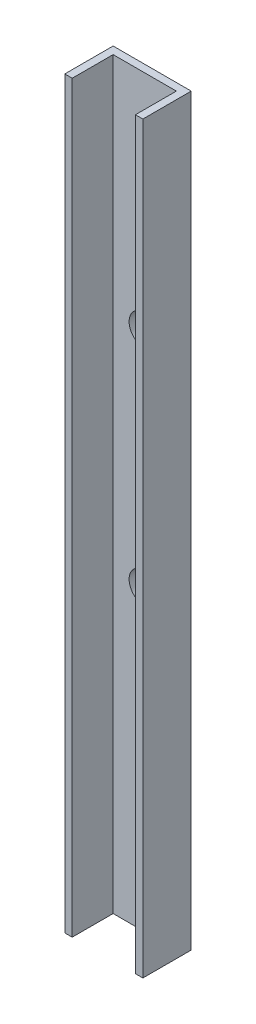
ISO-10303-21;
HEADER;
FILE_DESCRIPTION(('STEP AP214'),'2;1');
FILE_NAME('part.step','',(''),(''),'','','');
FILE_SCHEMA(('AUTOMOTIVE_DESIGN { 1 0 10303 214 1 1 1 1 }'));
ENDSEC;
DATA;
#1=APPLICATION_CONTEXT('core data for automotive mechanical design processes');
#2=APPLICATION_PROTOCOL_DEFINITION('international standard','automotive_design',2000,#1);
#3=PRODUCT_CONTEXT('',#1,'mechanical');
#4=PRODUCT('Part','Part','',(#3));
#5=PRODUCT_RELATED_PRODUCT_CATEGORY('part','',(#4));
#6=PRODUCT_DEFINITION_FORMATION('','',#4);
#7=PRODUCT_DEFINITION_CONTEXT('part definition',#1,'design');
#8=PRODUCT_DEFINITION('design','',#6,#7);
#9=PRODUCT_DEFINITION_SHAPE('','',#8);
#10=(LENGTH_UNIT() NAMED_UNIT(*) SI_UNIT(.MILLI.,.METRE.));
#11=(NAMED_UNIT(*) PLANE_ANGLE_UNIT() SI_UNIT($,.RADIAN.));
#12=(NAMED_UNIT(*) SI_UNIT($,.STERADIAN.) SOLID_ANGLE_UNIT());
#13=UNCERTAINTY_MEASURE_WITH_UNIT(LENGTH_MEASURE(1.E-05),#10,'distance_accuracy_value','');
#14=(GEOMETRIC_REPRESENTATION_CONTEXT(3) GLOBAL_UNCERTAINTY_ASSIGNED_CONTEXT((#13)) GLOBAL_UNIT_ASSIGNED_CONTEXT((#10,
#11,#12)) REPRESENTATION_CONTEXT('',''));
#15=CARTESIAN_POINT('',(0.,0.,0.));
#16=DIRECTION('',(0.,0.,1.));
#17=DIRECTION('',(1.,0.,0.));
#18=AXIS2_PLACEMENT_3D('',#15,#16,#17);
#19=CARTESIAN_POINT('',(6.03004291845494,100.,-4.68669527896996));
#20=DIRECTION('',(1.,0.,0.));
#21=DIRECTION('',(0.,0.,-1.));
#22=AXIS2_PLACEMENT_3D('',#19,#20,#21);
#23=PLANE('',#22);
#24=DIRECTION('',(0.,0.,1.));
#25=VECTOR('',#24,1.);
#26=CARTESIAN_POINT('',(6.03004291845494,0.,-4.68669527896996));
#27=LINE('',#26,#25);
#28=CARTESIAN_POINT('',(6.03004291845494,0.,-3.68669527896996));
#29=VERTEX_POINT('',#28);
#30=CARTESIAN_POINT('',(6.03004291845494,0.,1.81330472103004));
#31=VERTEX_POINT('',#30);
#32=EDGE_CURVE('E132',#29,#31,#27,.T.);
#33=ORIENTED_EDGE('',*,*,#32,.T.);
#34=DIRECTION('',(0.,-1.,0.));
#35=VECTOR('',#34,1.);
#36=CARTESIAN_POINT('',(6.03004291845494,100.,1.81330472103004));
#37=LINE('',#36,#35);
#38=CARTESIAN_POINT('',(6.03004291845494,100.,1.81330472103004));
#39=VERTEX_POINT('',#38);
#40=EDGE_CURVE('E11',#39,#31,#37,.T.);
#41=ORIENTED_EDGE('',*,*,#40,.F.);
#42=DIRECTION('',(0.,0.,1.));
#43=VECTOR('',#42,1.);
#44=CARTESIAN_POINT('',(6.03004291845494,100.,-4.68669527896996));
#45=LINE('',#44,#43);
#46=CARTESIAN_POINT('',(6.03004291845494,100.,-3.68669527896996));
#47=VERTEX_POINT('',#46);
#48=EDGE_CURVE('E90',#47,#39,#45,.T.);
#49=ORIENTED_EDGE('',*,*,#48,.F.);
#50=DIRECTION('',(0.,-1.,0.));
#51=VECTOR('',#50,1.);
#52=CARTESIAN_POINT('',(6.03004291845494,100.,-3.68669527896996));
#53=LINE('',#52,#51);
#54=EDGE_CURVE('E131',#47,#29,#53,.T.);
#55=ORIENTED_EDGE('',*,*,#54,.T.);
#56=EDGE_LOOP('',(#33,#41,#49,#55));
#57=FACE_BOUND('',#56,.T.);
#58=ADVANCED_FACE('F33',(#57),#23,.F.);
#59=CARTESIAN_POINT('',(7.03004291845494,100.,1.81330472103004));
#60=DIRECTION('',(0.,0.,1.));
#61=DIRECTION('',(1.,0.,0.));
#62=AXIS2_PLACEMENT_3D('',#59,#60,#61);
#63=PLANE('',#62);
#64=DIRECTION('',(-1.,0.,0.));
#65=VECTOR('',#64,1.);
#66=CARTESIAN_POINT('',(7.03004291845494,0.,1.81330472103004));
#67=LINE('',#66,#65);
#68=CARTESIAN_POINT('',(7.03004291845494,0.,1.81330472103004));
#69=VERTEX_POINT('',#68);
#70=EDGE_CURVE('E135',#69,#31,#67,.T.);
#71=ORIENTED_EDGE('',*,*,#70,.F.);
#72=DIRECTION('',(0.,-1.,0.));
#73=VECTOR('',#72,1.);
#74=CARTESIAN_POINT('',(7.03004291845494,100.,1.81330472103004));
#75=LINE('',#74,#73);
#76=CARTESIAN_POINT('',(7.03004291845494,100.,1.81330472103004));
#77=VERTEX_POINT('',#76);
#78=EDGE_CURVE('E42',#77,#69,#75,.T.);
#79=ORIENTED_EDGE('',*,*,#78,.F.);
#80=DIRECTION('',(-1.,0.,0.));
#81=VECTOR('',#80,1.);
#82=CARTESIAN_POINT('',(7.03004291845494,100.,1.81330472103004));
#83=LINE('',#82,#81);
#84=EDGE_CURVE('E171',#77,#39,#83,.T.);
#85=ORIENTED_EDGE('',*,*,#84,.T.);
#86=ORIENTED_EDGE('',*,*,#40,.T.);
#87=EDGE_LOOP('',(#71,#79,#85,#86));
#88=FACE_BOUND('',#87,.T.);
#89=ADVANCED_FACE('F204',(#88),#63,.T.);
#90=CARTESIAN_POINT('',(7.03004291845494,100.,-4.68669527896996));
#91=DIRECTION('',(1.,0.,0.));
#92=DIRECTION('',(0.,0.,-1.));
#93=AXIS2_PLACEMENT_3D('',#90,#91,#92);
#94=PLANE('',#93);
#95=DIRECTION('',(0.,0.,1.));
#96=VECTOR('',#95,1.);
#97=CARTESIAN_POINT('',(7.03004291845494,0.,-4.68669527896996));
#98=LINE('',#97,#96);
#99=CARTESIAN_POINT('',(7.03004291845494,0.,-4.68669527896996));
#100=VERTEX_POINT('',#99);
#101=EDGE_CURVE('E139',#100,#69,#98,.T.);
#102=ORIENTED_EDGE('',*,*,#101,.F.);
#103=DIRECTION('',(0.,-1.,0.));
#104=VECTOR('',#103,1.);
#105=CARTESIAN_POINT('',(7.03004291845494,100.,-4.68669527896996));
#106=LINE('',#105,#104);
#107=CARTESIAN_POINT('',(7.03004291845494,100.,-4.68669527896996));
#108=VERTEX_POINT('',#107);
#109=EDGE_CURVE('E156',#108,#100,#106,.T.);
#110=ORIENTED_EDGE('',*,*,#109,.F.);
#111=DIRECTION('',(0.,0.,1.));
#112=VECTOR('',#111,1.);
#113=CARTESIAN_POINT('',(7.03004291845494,100.,-4.68669527896996));
#114=LINE('',#113,#112);
#115=EDGE_CURVE('E174',#108,#77,#114,.T.);
#116=ORIENTED_EDGE('',*,*,#115,.T.);
#117=ORIENTED_EDGE('',*,*,#78,.T.);
#118=EDGE_LOOP('',(#102,#110,#116,#117));
#119=FACE_BOUND('',#118,.T.);
#120=ADVANCED_FACE('F208',(#119),#94,.T.);
#121=CARTESIAN_POINT('',(-3.46995708154506,100.,-4.68669527896996));
#122=DIRECTION('',(0.,0.,-1.));
#123=DIRECTION('',(-1.,0.,0.));
#124=AXIS2_PLACEMENT_3D('',#121,#122,#123);
#125=PLANE('',#124);
#126=CARTESIAN_POINT('',(1.78004291845492,40.,-4.68669527896996));
#127=DIRECTION('',(0.,0.,-1.));
#128=DIRECTION('',(-1.,0.,0.));
#129=AXIS2_PLACEMENT_3D('',#126,#127,#128);
#130=CIRCLE('',#129,2.1);
#131=CARTESIAN_POINT('',(-0.319957081545074,40.,-4.68669527896996));
#132=VERTEX_POINT('',#131);
#133=EDGE_CURVE('E167',#132,#132,#130,.T.);
#134=ORIENTED_EDGE('',*,*,#133,.F.);
#135=EDGE_LOOP('',(#134));
#136=FACE_BOUND('',#135,.T.);
#137=CARTESIAN_POINT('',(1.78004291845492,70.,-4.68669527896996));
#138=DIRECTION('',(0.,0.,-1.));
#139=DIRECTION('',(-1.,0.,0.));
#140=AXIS2_PLACEMENT_3D('',#137,#138,#139);
#141=CIRCLE('',#140,2.10000000000001);
#142=CARTESIAN_POINT('',(-0.319957081545088,70.,-4.68669527896996));
#143=VERTEX_POINT('',#142);
#144=EDGE_CURVE('E159',#143,#143,#141,.T.);
#145=ORIENTED_EDGE('',*,*,#144,.F.);
#146=EDGE_LOOP('',(#145));
#147=FACE_BOUND('',#146,.T.);
#148=DIRECTION('',(1.,0.,0.));
#149=VECTOR('',#148,1.);
#150=CARTESIAN_POINT('',(-3.46995708154506,0.,-4.68669527896996));
#151=LINE('',#150,#149);
#152=CARTESIAN_POINT('',(-3.46995708154506,0.,-4.68669527896996));
#153=VERTEX_POINT('',#152);
#154=EDGE_CURVE('E142',#153,#100,#151,.T.);
#155=ORIENTED_EDGE('',*,*,#154,.F.);
#156=DIRECTION('',(0.,-1.,0.));
#157=VECTOR('',#156,1.);
#158=CARTESIAN_POINT('',(-3.46995708154506,100.,-4.68669527896996));
#159=LINE('',#158,#157);
#160=CARTESIAN_POINT('',(-3.46995708154506,100.,-4.68669527896996));
#161=VERTEX_POINT('',#160);
#162=EDGE_CURVE('E154',#161,#153,#159,.T.);
#163=ORIENTED_EDGE('',*,*,#162,.F.);
#164=DIRECTION('',(1.,0.,0.));
#165=VECTOR('',#164,1.);
#166=CARTESIAN_POINT('',(-3.46995708154506,100.,-4.68669527896996));
#167=LINE('',#166,#165);
#168=EDGE_CURVE('E126',#161,#108,#167,.T.);
#169=ORIENTED_EDGE('',*,*,#168,.T.);
#170=ORIENTED_EDGE('',*,*,#109,.T.);
#171=EDGE_LOOP('',(#155,#163,#169,#170));
#172=FACE_BOUND('',#171,.T.);
#173=ADVANCED_FACE('F179',(#136,#147,#172),#125,.T.);
#174=CARTESIAN_POINT('',(-3.46995708154506,100.,1.81330472103004));
#175=DIRECTION('',(-1.,0.,0.));
#176=DIRECTION('',(0.,0.,1.));
#177=AXIS2_PLACEMENT_3D('',#174,#175,#176);
#178=PLANE('',#177);
#179=DIRECTION('',(0.,0.,-1.));
#180=VECTOR('',#179,1.);
#181=CARTESIAN_POINT('',(-3.46995708154506,0.,1.81330472103004));
#182=LINE('',#181,#180);
#183=CARTESIAN_POINT('',(-3.46995708154506,0.,1.81330472103004));
#184=VERTEX_POINT('',#183);
#185=EDGE_CURVE('E145',#184,#153,#182,.T.);
#186=ORIENTED_EDGE('',*,*,#185,.F.);
#187=DIRECTION('',(0.,-1.,0.));
#188=VECTOR('',#187,1.);
#189=CARTESIAN_POINT('',(-3.46995708154506,100.,1.81330472103004));
#190=LINE('',#189,#188);
#191=CARTESIAN_POINT('',(-3.46995708154506,100.,1.81330472103004));
#192=VERTEX_POINT('',#191);
#193=EDGE_CURVE('E114',#192,#184,#190,.T.);
#194=ORIENTED_EDGE('',*,*,#193,.F.);
#195=DIRECTION('',(0.,0.,-1.));
#196=VECTOR('',#195,1.);
#197=CARTESIAN_POINT('',(-3.46995708154506,100.,1.81330472103004));
#198=LINE('',#197,#196);
#199=EDGE_CURVE('E124',#192,#161,#198,.T.);
#200=ORIENTED_EDGE('',*,*,#199,.T.);
#201=ORIENTED_EDGE('',*,*,#162,.T.);
#202=EDGE_LOOP('',(#186,#194,#200,#201));
#203=FACE_BOUND('',#202,.T.);
#204=ADVANCED_FACE('F184',(#203),#178,.T.);
#205=CARTESIAN_POINT('',(-2.46995708154506,100.,1.81330472103004));
#206=DIRECTION('',(0.,0.,1.));
#207=DIRECTION('',(1.,0.,0.));
#208=AXIS2_PLACEMENT_3D('',#205,#206,#207);
#209=PLANE('',#208);
#210=DIRECTION('',(-1.,0.,0.));
#211=VECTOR('',#210,1.);
#212=CARTESIAN_POINT('',(-2.46995708154506,0.,1.81330472103004));
#213=LINE('',#212,#211);
#214=CARTESIAN_POINT('',(-2.46995708154506,0.,1.81330472103004));
#215=VERTEX_POINT('',#214);
#216=EDGE_CURVE('E113',#215,#184,#213,.T.);
#217=ORIENTED_EDGE('',*,*,#216,.F.);
#218=DIRECTION('',(0.,-1.,0.));
#219=VECTOR('',#218,1.);
#220=CARTESIAN_POINT('',(-2.46995708154506,100.,1.81330472103004));
#221=LINE('',#220,#219);
#222=CARTESIAN_POINT('',(-2.46995708154506,100.,1.81330472103004));
#223=VERTEX_POINT('',#222);
#224=EDGE_CURVE('E107',#223,#215,#221,.T.);
#225=ORIENTED_EDGE('',*,*,#224,.F.);
#226=DIRECTION('',(-1.,0.,0.));
#227=VECTOR('',#226,1.);
#228=CARTESIAN_POINT('',(-2.46995708154506,100.,1.81330472103004));
#229=LINE('',#228,#227);
#230=EDGE_CURVE('E111',#223,#192,#229,.T.);
#231=ORIENTED_EDGE('',*,*,#230,.T.);
#232=ORIENTED_EDGE('',*,*,#193,.T.);
#233=EDGE_LOOP('',(#217,#225,#231,#232));
#234=FACE_BOUND('',#233,.T.);
#235=ADVANCED_FACE('F109',(#234),#209,.T.);
#236=CARTESIAN_POINT('',(-2.46995708154506,100.,1.81330472103004));
#237=DIRECTION('',(-1.,0.,0.));
#238=DIRECTION('',(0.,0.,1.));
#239=AXIS2_PLACEMENT_3D('',#236,#237,#238);
#240=PLANE('',#239);
#241=DIRECTION('',(0.,0.,-1.));
#242=VECTOR('',#241,1.);
#243=CARTESIAN_POINT('',(-2.46995708154506,0.,1.81330472103004));
#244=LINE('',#243,#242);
#245=CARTESIAN_POINT('',(-2.46995708154506,0.,-3.68669527896996));
#246=VERTEX_POINT('',#245);
#247=EDGE_CURVE('E78',#215,#246,#244,.T.);
#248=ORIENTED_EDGE('',*,*,#247,.T.);
#249=DIRECTION('',(0.,-1.,0.));
#250=VECTOR('',#249,1.);
#251=CARTESIAN_POINT('',(-2.46995708154506,100.,-3.68669527896996));
#252=LINE('',#251,#250);
#253=CARTESIAN_POINT('',(-2.46995708154506,100.,-3.68669527896996));
#254=VERTEX_POINT('',#253);
#255=EDGE_CURVE('E115',#254,#246,#252,.T.);
#256=ORIENTED_EDGE('',*,*,#255,.F.);
#257=DIRECTION('',(0.,0.,-1.));
#258=VECTOR('',#257,1.);
#259=CARTESIAN_POINT('',(-2.46995708154506,100.,1.81330472103004));
#260=LINE('',#259,#258);
#261=EDGE_CURVE('E117',#223,#254,#260,.T.);
#262=ORIENTED_EDGE('',*,*,#261,.F.);
#263=ORIENTED_EDGE('',*,*,#224,.T.);
#264=EDGE_LOOP('',(#248,#256,#262,#263));
#265=FACE_BOUND('',#264,.T.);
#266=ADVANCED_FACE('F118',(#265),#240,.F.);
#267=CARTESIAN_POINT('',(-3.46995708154506,100.,-3.68669527896996));
#268=DIRECTION('',(0.,0.,-1.));
#269=DIRECTION('',(-1.,0.,0.));
#270=AXIS2_PLACEMENT_3D('',#267,#268,#269);
#271=PLANE('',#270);
#272=CARTESIAN_POINT('',(1.78004291845492,40.,-3.68669527896996));
#273=DIRECTION('',(0.,0.,-1.));
#274=DIRECTION('',(-1.,0.,0.));
#275=AXIS2_PLACEMENT_3D('',#272,#273,#274);
#276=CIRCLE('',#275,2.1);
#277=CARTESIAN_POINT('',(-0.319957081545074,40.,-3.68669527896996));
#278=VERTEX_POINT('',#277);
#279=EDGE_CURVE('E36',#278,#278,#276,.T.);
#280=ORIENTED_EDGE('',*,*,#279,.T.);
#281=EDGE_LOOP('',(#280));
#282=FACE_BOUND('',#281,.T.);
#283=CARTESIAN_POINT('',(1.78004291845492,70.,-3.68669527896996));
#284=DIRECTION('',(0.,0.,-1.));
#285=DIRECTION('',(-1.,0.,0.));
#286=AXIS2_PLACEMENT_3D('',#283,#284,#285);
#287=CIRCLE('',#286,2.10000000000001);
#288=CARTESIAN_POINT('',(-0.319957081545088,70.,-3.68669527896996));
#289=VERTEX_POINT('',#288);
#290=EDGE_CURVE('E136',#289,#289,#287,.T.);
#291=ORIENTED_EDGE('',*,*,#290,.T.);
#292=EDGE_LOOP('',(#291));
#293=FACE_BOUND('',#292,.T.);
#294=DIRECTION('',(1.,0.,0.));
#295=VECTOR('',#294,1.);
#296=CARTESIAN_POINT('',(-3.46995708154506,0.,-3.68669527896996));
#297=LINE('',#296,#295);
#298=EDGE_CURVE('E84',#246,#29,#297,.T.);
#299=ORIENTED_EDGE('',*,*,#298,.T.);
#300=ORIENTED_EDGE('',*,*,#54,.F.);
#301=DIRECTION('',(1.,0.,0.));
#302=VECTOR('',#301,1.);
#303=CARTESIAN_POINT('',(-3.46995708154506,100.,-3.68669527896996));
#304=LINE('',#303,#302);
#305=EDGE_CURVE('E51',#254,#47,#304,.T.);
#306=ORIENTED_EDGE('',*,*,#305,.F.);
#307=ORIENTED_EDGE('',*,*,#255,.T.);
#308=EDGE_LOOP('',(#299,#300,#306,#307));
#309=FACE_BOUND('',#308,.T.);
#310=ADVANCED_FACE('F190',(#282,#293,#309),#271,.F.);
#311=CARTESIAN_POINT('',(0.,100.,0.));
#312=DIRECTION('',(0.,-1.,0.));
#313=DIRECTION('',(-1.,0.,0.));
#314=AXIS2_PLACEMENT_3D('',#311,#312,#313);
#315=PLANE('',#314);
#316=ORIENTED_EDGE('',*,*,#48,.T.);
#317=ORIENTED_EDGE('',*,*,#84,.F.);
#318=ORIENTED_EDGE('',*,*,#115,.F.);
#319=ORIENTED_EDGE('',*,*,#168,.F.);
#320=ORIENTED_EDGE('',*,*,#199,.F.);
#321=ORIENTED_EDGE('',*,*,#230,.F.);
#322=ORIENTED_EDGE('',*,*,#261,.T.);
#323=ORIENTED_EDGE('',*,*,#305,.T.);
#324=EDGE_LOOP('',(#316,#317,#318,#319,#320,#321,#322,#323));
#325=FACE_BOUND('',#324,.T.);
#326=ADVANCED_FACE('F121',(#325),#315,.F.);
#327=CARTESIAN_POINT('',(0.,0.,0.));
#328=DIRECTION('',(0.,-1.,0.));
#329=DIRECTION('',(-1.,0.,0.));
#330=AXIS2_PLACEMENT_3D('',#327,#328,#329);
#331=PLANE('',#330);
#332=ORIENTED_EDGE('',*,*,#32,.F.);
#333=ORIENTED_EDGE('',*,*,#298,.F.);
#334=ORIENTED_EDGE('',*,*,#247,.F.);
#335=ORIENTED_EDGE('',*,*,#216,.T.);
#336=ORIENTED_EDGE('',*,*,#185,.T.);
#337=ORIENTED_EDGE('',*,*,#154,.T.);
#338=ORIENTED_EDGE('',*,*,#101,.T.);
#339=ORIENTED_EDGE('',*,*,#70,.T.);
#340=EDGE_LOOP('',(#332,#333,#334,#335,#336,#337,#338,#339));
#341=FACE_BOUND('',#340,.T.);
#342=ADVANCED_FACE('F187',(#341),#331,.T.);
#343=CARTESIAN_POINT('',(1.78004291845492,70.,5.31330472103004));
#344=DIRECTION('',(0.,0.,-1.));
#345=DIRECTION('',(-1.,0.,0.));
#346=AXIS2_PLACEMENT_3D('',#343,#344,#345);
#347=CYLINDRICAL_SURFACE('',#346,2.10000000000001);
#348=ORIENTED_EDGE('',*,*,#144,.T.);
#349=EDGE_LOOP('',(#348));
#350=FACE_BOUND('',#349,.T.);
#351=ORIENTED_EDGE('',*,*,#290,.F.);
#352=EDGE_LOOP('',(#351));
#353=FACE_BOUND('',#352,.T.);
#354=ADVANCED_FACE('F244',(#350,#353),#347,.F.);
#355=CARTESIAN_POINT('',(1.78004291845492,40.,5.31330472103004));
#356=DIRECTION('',(0.,0.,-1.));
#357=DIRECTION('',(-1.,0.,0.));
#358=AXIS2_PLACEMENT_3D('',#355,#356,#357);
#359=CYLINDRICAL_SURFACE('',#358,2.1);
#360=ORIENTED_EDGE('',*,*,#133,.T.);
#361=EDGE_LOOP('',(#360));
#362=FACE_BOUND('',#361,.T.);
#363=ORIENTED_EDGE('',*,*,#279,.F.);
#364=EDGE_LOOP('',(#363));
#365=FACE_BOUND('',#364,.T.);
#366=ADVANCED_FACE('F249',(#362,#365),#359,.F.);
#367=CLOSED_SHELL('',(#58,#89,#120,#173,#204,#235,#266,#310,#326,#342,#354,#366));
#368=MANIFOLD_SOLID_BREP('B2',#367);
#369=ADVANCED_BREP_SHAPE_REPRESENTATION('',(#18,#368),#14);
#370=SHAPE_DEFINITION_REPRESENTATION(#9,#369);
ENDSEC;
END-ISO-10303-21;
